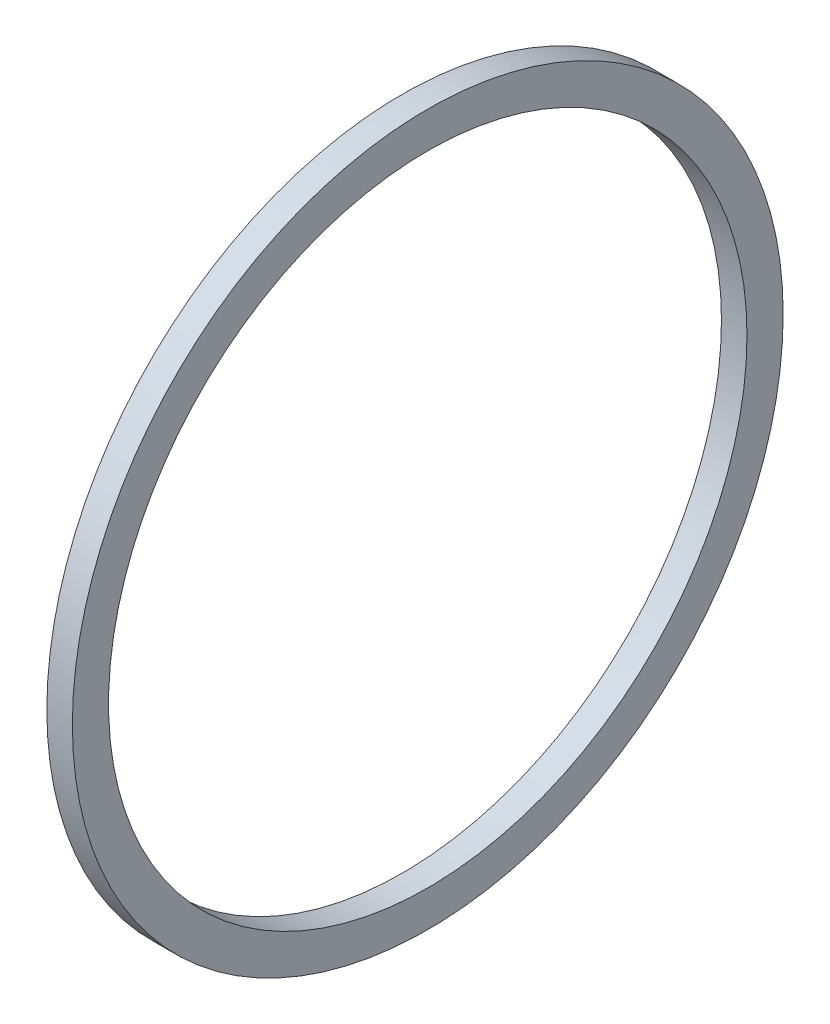
ISO-10303-21;
HEADER;
FILE_DESCRIPTION(('STEP AP214'),'2;1');
FILE_NAME('part.step','',(''),(''),'','','');
FILE_SCHEMA(('AUTOMOTIVE_DESIGN { 1 0 10303 214 1 1 1 1 }'));
ENDSEC;
DATA;
#1=APPLICATION_CONTEXT('core data for automotive mechanical design processes');
#2=APPLICATION_PROTOCOL_DEFINITION('international standard','automotive_design',2000,#1);
#3=PRODUCT_CONTEXT('',#1,'mechanical');
#4=PRODUCT('Part','Part','',(#3));
#5=PRODUCT_RELATED_PRODUCT_CATEGORY('part','',(#4));
#6=PRODUCT_DEFINITION_FORMATION('','',#4);
#7=PRODUCT_DEFINITION_CONTEXT('part definition',#1,'design');
#8=PRODUCT_DEFINITION('design','',#6,#7);
#9=PRODUCT_DEFINITION_SHAPE('','',#8);
#10=(LENGTH_UNIT() NAMED_UNIT(*) SI_UNIT(.MILLI.,.METRE.));
#11=(NAMED_UNIT(*) PLANE_ANGLE_UNIT() SI_UNIT($,.RADIAN.));
#12=(NAMED_UNIT(*) SI_UNIT($,.STERADIAN.) SOLID_ANGLE_UNIT());
#13=UNCERTAINTY_MEASURE_WITH_UNIT(LENGTH_MEASURE(1.E-05),#10,'distance_accuracy_value','');
#14=(GEOMETRIC_REPRESENTATION_CONTEXT(3) GLOBAL_UNCERTAINTY_ASSIGNED_CONTEXT((#13)) GLOBAL_UNIT_ASSIGNED_CONTEXT((#10,
#11,#12)) REPRESENTATION_CONTEXT('',''));
#15=CARTESIAN_POINT('',(0.,0.,0.));
#16=DIRECTION('',(0.,0.,1.));
#17=DIRECTION('',(1.,0.,0.));
#18=AXIS2_PLACEMENT_3D('',#15,#16,#17);
#19=CARTESIAN_POINT('',(1.2,0.,0.));
#20=DIRECTION('',(1.,0.,0.));
#21=DIRECTION('',(0.,0.,-1.));
#22=AXIS2_PLACEMENT_3D('',#19,#20,#21);
#23=PLANE('',#22);
#24=CARTESIAN_POINT('',(1.2,0.,0.));
#25=DIRECTION('',(1.,0.,0.));
#26=DIRECTION('',(0.,0.,-1.));
#27=AXIS2_PLACEMENT_3D('',#24,#25,#26);
#28=CIRCLE('',#27,16.7);
#29=CARTESIAN_POINT('',(1.2,0.,-16.7));
#30=VERTEX_POINT('',#29);
#31=EDGE_CURVE('E10',#30,#30,#28,.T.);
#32=ORIENTED_EDGE('',*,*,#31,.T.);
#33=EDGE_LOOP('',(#32));
#34=FACE_BOUND('',#33,.T.);
#35=CARTESIAN_POINT('',(1.2,0.,0.));
#36=DIRECTION('',(1.,0.,0.));
#37=DIRECTION('',(0.,0.,-1.));
#38=AXIS2_PLACEMENT_3D('',#35,#36,#37);
#39=CIRCLE('',#38,15.);
#40=CARTESIAN_POINT('',(1.2,0.,-15.));
#41=VERTEX_POINT('',#40);
#42=EDGE_CURVE('E42',#41,#41,#39,.T.);
#43=ORIENTED_EDGE('',*,*,#42,.F.);
#44=EDGE_LOOP('',(#43));
#45=FACE_BOUND('',#44,.T.);
#46=ADVANCED_FACE('F31',(#34,#45),#23,.T.);
#47=CARTESIAN_POINT('',(0.,0.,0.));
#48=DIRECTION('',(1.,0.,0.));
#49=DIRECTION('',(0.,0.,-1.));
#50=AXIS2_PLACEMENT_3D('',#47,#48,#49);
#51=PLANE('',#50);
#52=CARTESIAN_POINT('',(0.,0.,0.));
#53=DIRECTION('',(1.,0.,0.));
#54=DIRECTION('',(0.,0.,-1.));
#55=AXIS2_PLACEMENT_3D('',#52,#53,#54);
#56=CIRCLE('',#55,16.7);
#57=CARTESIAN_POINT('',(0.,0.,-16.7));
#58=VERTEX_POINT('',#57);
#59=EDGE_CURVE('E35',#58,#58,#56,.T.);
#60=ORIENTED_EDGE('',*,*,#59,.F.);
#61=EDGE_LOOP('',(#60));
#62=FACE_BOUND('',#61,.T.);
#63=CARTESIAN_POINT('',(0.,0.,0.));
#64=DIRECTION('',(1.,0.,0.));
#65=DIRECTION('',(0.,0.,-1.));
#66=AXIS2_PLACEMENT_3D('',#63,#64,#65);
#67=CIRCLE('',#66,15.);
#68=CARTESIAN_POINT('',(0.,0.,-15.));
#69=VERTEX_POINT('',#68);
#70=EDGE_CURVE('E44',#69,#69,#67,.T.);
#71=ORIENTED_EDGE('',*,*,#70,.T.);
#72=EDGE_LOOP('',(#71));
#73=FACE_BOUND('',#72,.T.);
#74=ADVANCED_FACE('F54',(#62,#73),#51,.F.);
#75=CARTESIAN_POINT('',(1.2,0.,0.));
#76=DIRECTION('',(-1.,0.,0.));
#77=DIRECTION('',(0.,0.,1.));
#78=AXIS2_PLACEMENT_3D('',#75,#76,#77);
#79=CYLINDRICAL_SURFACE('',#78,16.7);
#80=ORIENTED_EDGE('',*,*,#31,.F.);
#81=EDGE_LOOP('',(#80));
#82=FACE_BOUND('',#81,.T.);
#83=ORIENTED_EDGE('',*,*,#59,.T.);
#84=EDGE_LOOP('',(#83));
#85=FACE_BOUND('',#84,.T.);
#86=ADVANCED_FACE('F33',(#82,#85),#79,.T.);
#87=CARTESIAN_POINT('',(1.2,0.,0.));
#88=DIRECTION('',(-1.,0.,0.));
#89=DIRECTION('',(0.,0.,1.));
#90=AXIS2_PLACEMENT_3D('',#87,#88,#89);
#91=CYLINDRICAL_SURFACE('',#90,15.);
#92=ORIENTED_EDGE('',*,*,#42,.T.);
#93=EDGE_LOOP('',(#92));
#94=FACE_BOUND('',#93,.T.);
#95=ORIENTED_EDGE('',*,*,#70,.F.);
#96=EDGE_LOOP('',(#95));
#97=FACE_BOUND('',#96,.T.);
#98=ADVANCED_FACE('F50',(#94,#97),#91,.F.);
#99=CLOSED_SHELL('',(#46,#74,#86,#98));
#100=MANIFOLD_SOLID_BREP('B2',#99);
#101=ADVANCED_BREP_SHAPE_REPRESENTATION('',(#18,#100),#14);
#102=SHAPE_DEFINITION_REPRESENTATION(#9,#101);
ENDSEC;
END-ISO-10303-21;
